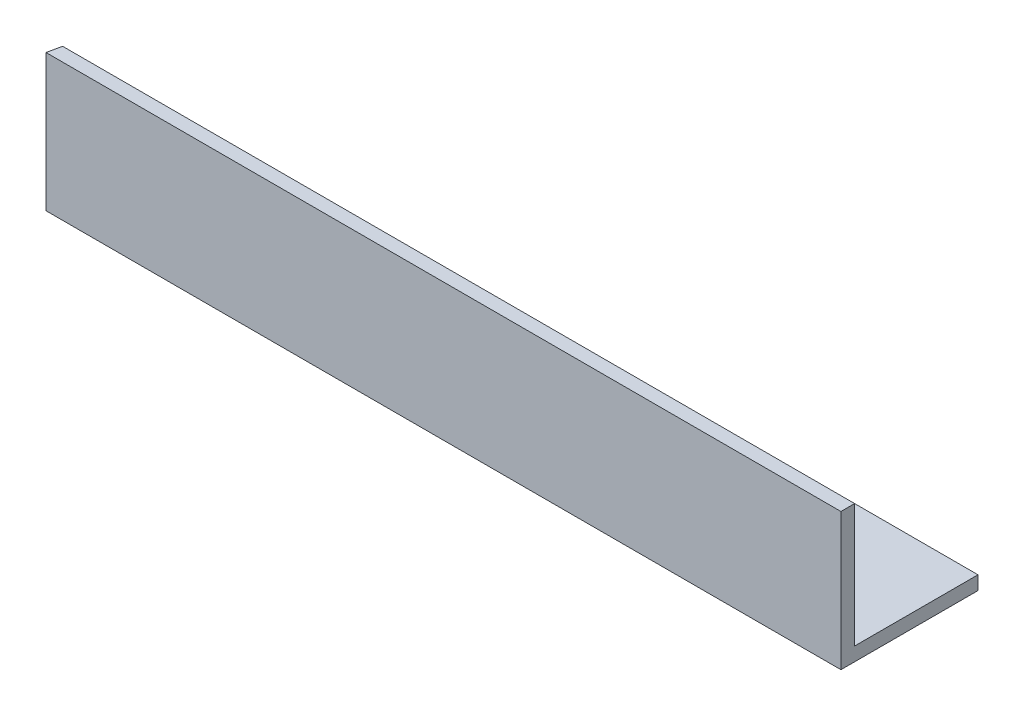
ISO-10303-21;
HEADER;
FILE_DESCRIPTION(('STEP AP214'),'2;1');
FILE_NAME('part.step','',(''),(''),'','','');
FILE_SCHEMA(('AUTOMOTIVE_DESIGN { 1 0 10303 214 1 1 1 1 }'));
ENDSEC;
DATA;
#1=APPLICATION_CONTEXT('core data for automotive mechanical design processes');
#2=APPLICATION_PROTOCOL_DEFINITION('international standard','automotive_design',2000,#1);
#3=PRODUCT_CONTEXT('',#1,'mechanical');
#4=PRODUCT('Part','Part','',(#3));
#5=PRODUCT_RELATED_PRODUCT_CATEGORY('part','',(#4));
#6=PRODUCT_DEFINITION_FORMATION('','',#4);
#7=PRODUCT_DEFINITION_CONTEXT('part definition',#1,'design');
#8=PRODUCT_DEFINITION('design','',#6,#7);
#9=PRODUCT_DEFINITION_SHAPE('','',#8);
#10=(LENGTH_UNIT() NAMED_UNIT(*) SI_UNIT(.MILLI.,.METRE.));
#11=(NAMED_UNIT(*) PLANE_ANGLE_UNIT() SI_UNIT($,.RADIAN.));
#12=(NAMED_UNIT(*) SI_UNIT($,.STERADIAN.) SOLID_ANGLE_UNIT());
#13=UNCERTAINTY_MEASURE_WITH_UNIT(LENGTH_MEASURE(1.E-05),#10,'distance_accuracy_value','');
#14=(GEOMETRIC_REPRESENTATION_CONTEXT(3) GLOBAL_UNCERTAINTY_ASSIGNED_CONTEXT((#13)) GLOBAL_UNIT_ASSIGNED_CONTEXT((#10,
#11,#12)) REPRESENTATION_CONTEXT('',''));
#15=CARTESIAN_POINT('',(0.,0.,0.));
#16=DIRECTION('',(0.,0.,1.));
#17=DIRECTION('',(1.,0.,0.));
#18=AXIS2_PLACEMENT_3D('',#15,#16,#17);
#19=CARTESIAN_POINT('',(116.,20.,0.));
#20=DIRECTION('',(0.,-1.,0.));
#21=DIRECTION('',(0.,0.,-1.));
#22=AXIS2_PLACEMENT_3D('',#19,#20,#21);
#23=PLANE('',#22);
#24=DIRECTION('',(-1.,0.,0.));
#25=VECTOR('',#24,1.);
#26=CARTESIAN_POINT('',(116.,20.,-2.));
#27=LINE('',#26,#25);
#28=CARTESIAN_POINT('',(116.,20.,-2.));
#29=VERTEX_POINT('',#28);
#30=CARTESIAN_POINT('',(0.425113123340026,20.,-2.));
#31=VERTEX_POINT('',#30);
#32=EDGE_CURVE('E104',#29,#31,#27,.T.);
#33=ORIENTED_EDGE('',*,*,#32,.T.);
#34=DIRECTION('',(-0.207911690817752,0.,0.978147600733807));
#35=VECTOR('',#34,1.);
#36=CARTESIAN_POINT('',(0.,20.,0.));
#37=LINE('',#36,#35);
#38=CARTESIAN_POINT('',(0.,20.,0.));
#39=VERTEX_POINT('',#38);
#40=EDGE_CURVE('E90',#31,#39,#37,.T.);
#41=ORIENTED_EDGE('',*,*,#40,.T.);
#42=DIRECTION('',(-1.,0.,0.));
#43=VECTOR('',#42,1.);
#44=CARTESIAN_POINT('',(116.,20.,0.));
#45=LINE('',#44,#43);
#46=CARTESIAN_POINT('',(116.,20.,0.));
#47=VERTEX_POINT('',#46);
#48=EDGE_CURVE('E11',#47,#39,#45,.T.);
#49=ORIENTED_EDGE('',*,*,#48,.F.);
#50=DIRECTION('',(0.,0.,1.));
#51=VECTOR('',#50,1.);
#52=CARTESIAN_POINT('',(116.,20.,0.));
#53=LINE('',#52,#51);
#54=EDGE_CURVE('E97',#29,#47,#53,.T.);
#55=ORIENTED_EDGE('',*,*,#54,.F.);
#56=EDGE_LOOP('',(#33,#41,#49,#55));
#57=FACE_BOUND('',#56,.T.);
#58=ADVANCED_FACE('F39',(#57),#23,.F.);
#59=CARTESIAN_POINT('',(116.,20.,0.));
#60=DIRECTION('',(0.,0.,-1.));
#61=DIRECTION('',(-1.,0.,0.));
#62=AXIS2_PLACEMENT_3D('',#59,#60,#61);
#63=PLANE('',#62);
#64=DIRECTION('',(0.,-1.,0.));
#65=VECTOR('',#64,1.);
#66=CARTESIAN_POINT('',(0.,20.,0.));
#67=LINE('',#66,#65);
#68=CARTESIAN_POINT('',(0.,0.,0.));
#69=VERTEX_POINT('',#68);
#70=EDGE_CURVE('E87',#39,#69,#67,.T.);
#71=ORIENTED_EDGE('',*,*,#70,.T.);
#72=DIRECTION('',(-1.,0.,0.));
#73=VECTOR('',#72,1.);
#74=CARTESIAN_POINT('',(116.,0.,0.));
#75=LINE('',#74,#73);
#76=CARTESIAN_POINT('',(116.,0.,0.));
#77=VERTEX_POINT('',#76);
#78=EDGE_CURVE('E47',#77,#69,#75,.T.);
#79=ORIENTED_EDGE('',*,*,#78,.F.);
#80=DIRECTION('',(0.,-1.,0.));
#81=VECTOR('',#80,1.);
#82=CARTESIAN_POINT('',(116.,20.,0.));
#83=LINE('',#82,#81);
#84=EDGE_CURVE('E108',#47,#77,#83,.T.);
#85=ORIENTED_EDGE('',*,*,#84,.F.);
#86=ORIENTED_EDGE('',*,*,#48,.T.);
#87=EDGE_LOOP('',(#71,#79,#85,#86));
#88=FACE_BOUND('',#87,.T.);
#89=ADVANCED_FACE('F107',(#88),#63,.F.);
#90=CARTESIAN_POINT('',(116.,0.,0.));
#91=DIRECTION('',(0.,1.,0.));
#92=DIRECTION('',(0.,0.,1.));
#93=AXIS2_PLACEMENT_3D('',#90,#91,#92);
#94=PLANE('',#93);
#95=ORIENTED_EDGE('',*,*,#78,.T.);
#96=DIRECTION('',(-0.207911690817752,0.,0.978147600733807));
#97=VECTOR('',#96,1.);
#98=CARTESIAN_POINT('',(0.,0.,0.));
#99=LINE('',#98,#97);
#100=CARTESIAN_POINT('',(4.25113123340029,0.,-20.));
#101=VERTEX_POINT('',#100);
#102=EDGE_CURVE('E93',#101,#69,#99,.T.);
#103=ORIENTED_EDGE('',*,*,#102,.F.);
#104=DIRECTION('',(-1.,0.,0.));
#105=VECTOR('',#104,1.);
#106=CARTESIAN_POINT('',(116.,0.,-20.));
#107=LINE('',#106,#105);
#108=CARTESIAN_POINT('',(116.,0.,-20.));
#109=VERTEX_POINT('',#108);
#110=EDGE_CURVE('E130',#109,#101,#107,.T.);
#111=ORIENTED_EDGE('',*,*,#110,.F.);
#112=DIRECTION('',(0.,0.,-1.));
#113=VECTOR('',#112,1.);
#114=CARTESIAN_POINT('',(116.,0.,0.));
#115=LINE('',#114,#113);
#116=EDGE_CURVE('E110',#77,#109,#115,.T.);
#117=ORIENTED_EDGE('',*,*,#116,.F.);
#118=EDGE_LOOP('',(#95,#103,#111,#117));
#119=FACE_BOUND('',#118,.T.);
#120=ADVANCED_FACE('F133',(#119),#94,.F.);
#121=CARTESIAN_POINT('',(116.,0.,-20.));
#122=DIRECTION('',(0.,0.,1.));
#123=DIRECTION('',(1.,0.,0.));
#124=AXIS2_PLACEMENT_3D('',#121,#122,#123);
#125=PLANE('',#124);
#126=ORIENTED_EDGE('',*,*,#110,.T.);
#127=DIRECTION('',(0.,-1.,0.));
#128=VECTOR('',#127,1.);
#129=CARTESIAN_POINT('',(4.25113123340029,20.,-20.));
#130=LINE('',#129,#128);
#131=CARTESIAN_POINT('',(4.25113123340029,2.,-20.));
#132=VERTEX_POINT('',#131);
#133=EDGE_CURVE('E105',#132,#101,#130,.T.);
#134=ORIENTED_EDGE('',*,*,#133,.F.);
#135=DIRECTION('',(-1.,0.,0.));
#136=VECTOR('',#135,1.);
#137=CARTESIAN_POINT('',(116.,2.,-20.));
#138=LINE('',#137,#136);
#139=CARTESIAN_POINT('',(116.,2.,-20.));
#140=VERTEX_POINT('',#139);
#141=EDGE_CURVE('E127',#140,#132,#138,.T.);
#142=ORIENTED_EDGE('',*,*,#141,.F.);
#143=DIRECTION('',(0.,1.,0.));
#144=VECTOR('',#143,1.);
#145=CARTESIAN_POINT('',(116.,0.,-20.));
#146=LINE('',#145,#144);
#147=EDGE_CURVE('E118',#109,#140,#146,.T.);
#148=ORIENTED_EDGE('',*,*,#147,.F.);
#149=EDGE_LOOP('',(#126,#134,#142,#148));
#150=FACE_BOUND('',#149,.T.);
#151=ADVANCED_FACE('F141',(#150),#125,.F.);
#152=CARTESIAN_POINT('',(116.,2.,-20.));
#153=DIRECTION('',(0.,-1.,0.));
#154=DIRECTION('',(0.,0.,-1.));
#155=AXIS2_PLACEMENT_3D('',#152,#153,#154);
#156=PLANE('',#155);
#157=ORIENTED_EDGE('',*,*,#141,.T.);
#158=DIRECTION('',(-0.207911690817752,0.,0.978147600733807));
#159=VECTOR('',#158,1.);
#160=CARTESIAN_POINT('',(9.08172988748669,2.,-42.7261798748217));
#161=LINE('',#160,#159);
#162=CARTESIAN_POINT('',(0.425113123340037,2.,-2.));
#163=VERTEX_POINT('',#162);
#164=EDGE_CURVE('E98',#132,#163,#161,.T.);
#165=ORIENTED_EDGE('',*,*,#164,.T.);
#166=DIRECTION('',(-1.,0.,0.));
#167=VECTOR('',#166,1.);
#168=CARTESIAN_POINT('',(116.,2.,-2.));
#169=LINE('',#168,#167);
#170=CARTESIAN_POINT('',(116.,2.,-2.));
#171=VERTEX_POINT('',#170);
#172=EDGE_CURVE('E124',#171,#163,#169,.T.);
#173=ORIENTED_EDGE('',*,*,#172,.F.);
#174=DIRECTION('',(0.,0.,1.));
#175=VECTOR('',#174,1.);
#176=CARTESIAN_POINT('',(116.,2.,-20.));
#177=LINE('',#176,#175);
#178=EDGE_CURVE('E120',#140,#171,#177,.T.);
#179=ORIENTED_EDGE('',*,*,#178,.F.);
#180=EDGE_LOOP('',(#157,#165,#173,#179));
#181=FACE_BOUND('',#180,.T.);
#182=ADVANCED_FACE('F144',(#181),#156,.F.);
#183=CARTESIAN_POINT('',(116.,2.,-2.));
#184=DIRECTION('',(0.,0.,1.));
#185=DIRECTION('',(0.,-1.,0.));
#186=AXIS2_PLACEMENT_3D('',#183,#184,#185);
#187=PLANE('',#186);
#188=ORIENTED_EDGE('',*,*,#172,.T.);
#189=DIRECTION('',(0.,1.,0.));
#190=VECTOR('',#189,1.);
#191=CARTESIAN_POINT('',(0.425113123340037,2.,-2.));
#192=LINE('',#191,#190);
#193=EDGE_CURVE('E147',#163,#31,#192,.T.);
#194=ORIENTED_EDGE('',*,*,#193,.T.);
#195=ORIENTED_EDGE('',*,*,#32,.F.);
#196=DIRECTION('',(0.,1.,0.));
#197=VECTOR('',#196,1.);
#198=CARTESIAN_POINT('',(116.,2.,-2.));
#199=LINE('',#198,#197);
#200=EDGE_CURVE('E54',#171,#29,#199,.T.);
#201=ORIENTED_EDGE('',*,*,#200,.F.);
#202=EDGE_LOOP('',(#188,#194,#195,#201));
#203=FACE_BOUND('',#202,.T.);
#204=ADVANCED_FACE('F146',(#203),#187,.F.);
#205=CARTESIAN_POINT('',(116.,0.,0.));
#206=DIRECTION('',(1.,0.,0.));
#207=DIRECTION('',(0.,0.,-1.));
#208=AXIS2_PLACEMENT_3D('',#205,#206,#207);
#209=PLANE('',#208);
#210=ORIENTED_EDGE('',*,*,#54,.T.);
#211=ORIENTED_EDGE('',*,*,#84,.T.);
#212=ORIENTED_EDGE('',*,*,#116,.T.);
#213=ORIENTED_EDGE('',*,*,#147,.T.);
#214=ORIENTED_EDGE('',*,*,#178,.T.);
#215=ORIENTED_EDGE('',*,*,#200,.T.);
#216=EDGE_LOOP('',(#210,#211,#212,#213,#214,#215));
#217=FACE_BOUND('',#216,.T.);
#218=ADVANCED_FACE('F112',(#217),#209,.T.);
#219=CARTESIAN_POINT('',(0.,20.,0.));
#220=DIRECTION('',(0.978147600733807,0.,0.207911690817752));
#221=DIRECTION('',(0.207911690817752,0.,-0.978147600733807));
#222=AXIS2_PLACEMENT_3D('',#219,#220,#221);
#223=PLANE('',#222);
#224=ORIENTED_EDGE('',*,*,#133,.T.);
#225=ORIENTED_EDGE('',*,*,#102,.T.);
#226=ORIENTED_EDGE('',*,*,#70,.F.);
#227=ORIENTED_EDGE('',*,*,#40,.F.);
#228=ORIENTED_EDGE('',*,*,#193,.F.);
#229=ORIENTED_EDGE('',*,*,#164,.F.);
#230=EDGE_LOOP('',(#224,#225,#226,#227,#228,#229));
#231=FACE_BOUND('',#230,.T.);
#232=ADVANCED_FACE('F89',(#231),#223,.F.);
#233=CLOSED_SHELL('',(#58,#89,#120,#151,#182,#204,#218,#232));
#234=MANIFOLD_SOLID_BREP('B2',#233);
#235=ADVANCED_BREP_SHAPE_REPRESENTATION('',(#18,#234),#14);
#236=SHAPE_DEFINITION_REPRESENTATION(#9,#235);
ENDSEC;
END-ISO-10303-21;
